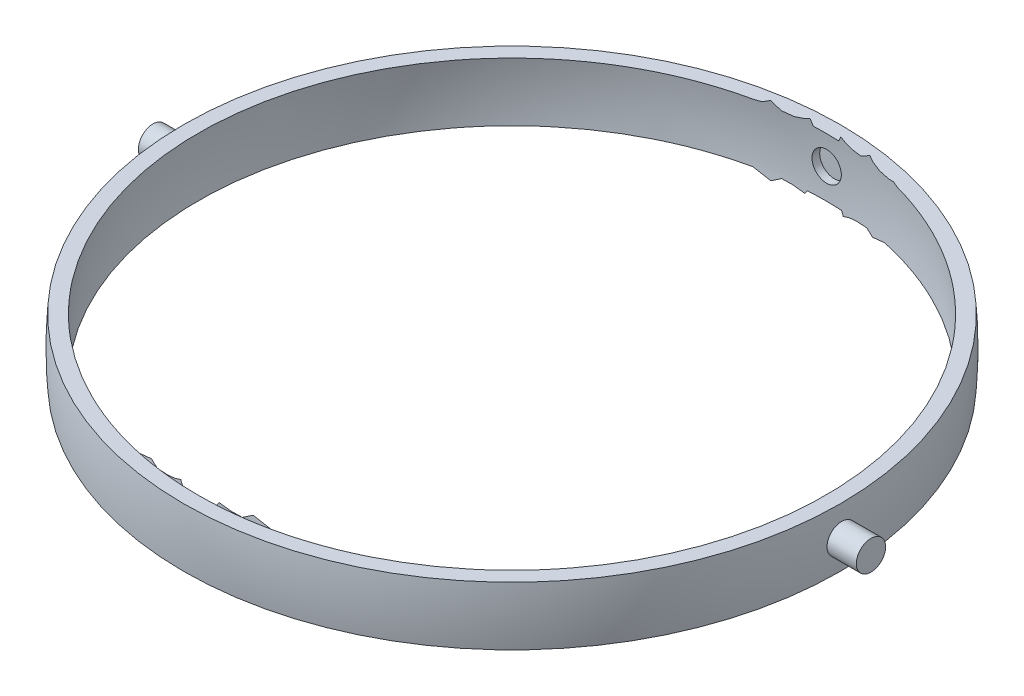
ISO-10303-21;
HEADER;
FILE_DESCRIPTION(('STEP AP214'),'2;1');
FILE_NAME('part.step','',(''),(''),'','','');
FILE_SCHEMA(('AUTOMOTIVE_DESIGN { 1 0 10303 214 1 1 1 1 }'));
ENDSEC;
DATA;
#1=APPLICATION_CONTEXT('core data for automotive mechanical design processes');
#2=APPLICATION_PROTOCOL_DEFINITION('international standard','automotive_design',2000,#1);
#3=PRODUCT_CONTEXT('',#1,'mechanical');
#4=PRODUCT('Part','Part','',(#3));
#5=PRODUCT_RELATED_PRODUCT_CATEGORY('part','',(#4));
#6=PRODUCT_DEFINITION_FORMATION('','',#4);
#7=PRODUCT_DEFINITION_CONTEXT('part definition',#1,'design');
#8=PRODUCT_DEFINITION('design','',#6,#7);
#9=PRODUCT_DEFINITION_SHAPE('','',#8);
#10=(LENGTH_UNIT() NAMED_UNIT(*) SI_UNIT(.MILLI.,.METRE.));
#11=(NAMED_UNIT(*) PLANE_ANGLE_UNIT() SI_UNIT($,.RADIAN.));
#12=(NAMED_UNIT(*) SI_UNIT($,.STERADIAN.) SOLID_ANGLE_UNIT());
#13=UNCERTAINTY_MEASURE_WITH_UNIT(LENGTH_MEASURE(1.E-05),#10,'distance_accuracy_value','');
#14=(GEOMETRIC_REPRESENTATION_CONTEXT(3) GLOBAL_UNCERTAINTY_ASSIGNED_CONTEXT((#13)) GLOBAL_UNIT_ASSIGNED_CONTEXT((#10,
#11,#12)) REPRESENTATION_CONTEXT('',''));
#15=CARTESIAN_POINT('',(0.,0.,0.));
#16=DIRECTION('',(0.,0.,1.));
#17=DIRECTION('',(1.,0.,0.));
#18=AXIS2_PLACEMENT_3D('',#15,#16,#17);
#19=CARTESIAN_POINT('',(0.,0.,0.));
#20=DIRECTION('',(0.,0.,1.));
#21=DIRECTION('',(1.,0.,0.));
#22=AXIS2_PLACEMENT_3D('',#19,#20,#21);
#23=CYLINDRICAL_SURFACE('',#22,2.);
#24=CARTESIAN_POINT('',(0.,0.,-44.));
#25=DIRECTION('',(0.,0.,-1.));
#26=DIRECTION('',(1.,0.,0.));
#27=AXIS2_PLACEMENT_3D('',#24,#25,#26);
#28=CIRCLE('',#27,2.);
#29=CARTESIAN_POINT('',(-2.,0.,-44.));
#30=VERTEX_POINT('',#29);
#31=EDGE_CURVE('P0_E10',#30,#30,#28,.T.);
#32=ORIENTED_EDGE('',*,*,#31,.T.);
#33=DIRECTION('',(0.,0.,1.));
#34=VECTOR('',#33,1.);
#35=CARTESIAN_POINT('',(-2.,0.,0.));
#36=LINE('',#35,#34);
#37=CARTESIAN_POINT('',(-2.,0.,-42.9534631898291));
#38=VERTEX_POINT('',#37);
#39=EDGE_CURVE('P0_E26',#30,#38,#36,.T.);
#40=ORIENTED_EDGE('',*,*,#39,.T.);
#41=CARTESIAN_POINT('',(0.,0.,-42.9534631898291));
#42=DIRECTION('',(0.,0.,-1.));
#43=DIRECTION('',(1.,0.,0.));
#44=AXIS2_PLACEMENT_3D('',#41,#42,#43);
#45=CIRCLE('',#44,2.);
#46=EDGE_CURVE('P0_E130',#38,#38,#45,.T.);
#47=ORIENTED_EDGE('',*,*,#46,.F.);
#48=ORIENTED_EDGE('',*,*,#39,.F.);
#49=EDGE_LOOP('',(#32,#40,#47,#48));
#50=FACE_BOUND('',#49,.T.);
#51=ADVANCED_FACE('P0_F15',(#50),#23,.F.);
#52=CARTESIAN_POINT('',(0.,0.,-44.));
#53=DIRECTION('',(0.,0.,1.));
#54=DIRECTION('',(1.,0.,0.));
#55=AXIS2_PLACEMENT_3D('',#52,#53,#54);
#56=PLANE('',#55);
#57=ORIENTED_EDGE('',*,*,#31,.F.);
#58=EDGE_LOOP('',(#57));
#59=FACE_BOUND('',#58,.T.);
#60=ADVANCED_FACE('P0_F147',(#59),#56,.T.);
#61=CARTESIAN_POINT('',(0.,0.,0.));
#62=DIRECTION('',(0.,0.,1.));
#63=DIRECTION('',(1.,0.,0.));
#64=AXIS2_PLACEMENT_3D('',#61,#62,#63);
#65=CYLINDRICAL_SURFACE('',#64,2.);
#66=CARTESIAN_POINT('',(0.,0.,42.9534631898291));
#67=DIRECTION('',(0.,0.,1.));
#68=DIRECTION('',(1.,0.,0.));
#69=AXIS2_PLACEMENT_3D('',#66,#67,#68);
#70=CIRCLE('',#69,2.);
#71=CARTESIAN_POINT('',(-2.,0.,42.9534631898291));
#72=VERTEX_POINT('',#71);
#73=EDGE_CURVE('P0_E88',#72,#72,#70,.T.);
#74=ORIENTED_EDGE('',*,*,#73,.F.);
#75=DIRECTION('',(0.,0.,1.));
#76=VECTOR('',#75,1.);
#77=CARTESIAN_POINT('',(-2.,0.,0.));
#78=LINE('',#77,#76);
#79=CARTESIAN_POINT('',(-2.,0.,44.));
#80=VERTEX_POINT('',#79);
#81=EDGE_CURVE('P0_E113',#72,#80,#78,.T.);
#82=ORIENTED_EDGE('',*,*,#81,.T.);
#83=CARTESIAN_POINT('',(0.,0.,44.));
#84=DIRECTION('',(0.,0.,1.));
#85=DIRECTION('',(1.,0.,0.));
#86=AXIS2_PLACEMENT_3D('',#83,#84,#85);
#87=CIRCLE('',#86,2.);
#88=EDGE_CURVE('P0_E123',#80,#80,#87,.T.);
#89=ORIENTED_EDGE('',*,*,#88,.T.);
#90=ORIENTED_EDGE('',*,*,#81,.F.);
#91=EDGE_LOOP('',(#74,#82,#89,#90));
#92=FACE_BOUND('',#91,.T.);
#93=ADVANCED_FACE('P0_F144',(#92),#65,.F.);
#94=CARTESIAN_POINT('',(0.,0.,44.));
#95=DIRECTION('',(0.,0.,1.));
#96=DIRECTION('',(1.,0.,0.));
#97=AXIS2_PLACEMENT_3D('',#94,#95,#96);
#98=PLANE('',#97);
#99=ORIENTED_EDGE('',*,*,#88,.F.);
#100=EDGE_LOOP('',(#99));
#101=FACE_BOUND('',#100,.T.);
#102=ADVANCED_FACE('P0_F146',(#101),#98,.F.);
#103=CARTESIAN_POINT('',(0.,0.,0.));
#104=DIRECTION('',(0.,0.,1.));
#105=DIRECTION('',(1.,0.,0.));
#106=AXIS2_PLACEMENT_3D('',#103,#104,#105);
#107=SPHERICAL_SURFACE('',#106,43.);
#108=ORIENTED_EDGE('',*,*,#46,.T.);
#109=CARTESIAN_POINT('',(0.,0.,0.));
#110=DIRECTION('',(0.,1.,0.));
#111=DIRECTION('',(-1.,0.,0.));
#112=AXIS2_PLACEMENT_3D('',#109,#110,#111);
#113=CIRCLE('',#112,43.);
#114=EDGE_CURVE('P0_E19',#38,#72,#113,.T.);
#115=ORIENTED_EDGE('',*,*,#114,.T.);
#116=ORIENTED_EDGE('',*,*,#73,.T.);
#117=ORIENTED_EDGE('',*,*,#114,.F.);
#118=EDGE_LOOP('',(#108,#115,#116,#117));
#119=FACE_BOUND('',#118,.T.);
#120=CARTESIAN_POINT('',(0.,-4.,0.));
#121=DIRECTION('',(0.,1.,0.));
#122=DIRECTION('',(0.,0.,-1.));
#123=AXIS2_PLACEMENT_3D('',#120,#121,#122);
#124=CIRCLE('',#123,42.8135492572153);
#125=CARTESIAN_POINT('',(0.,-4.,42.8135492572153));
#126=VERTEX_POINT('',#125);
#127=EDGE_CURVE('P0_E83',#126,#126,#124,.T.);
#128=ORIENTED_EDGE('',*,*,#127,.F.);
#129=EDGE_LOOP('',(#128));
#130=FACE_BOUND('',#129,.T.);
#131=CARTESIAN_POINT('',(0.,4.,0.));
#132=DIRECTION('',(0.,-1.,0.));
#133=DIRECTION('',(0.,0.,1.));
#134=AXIS2_PLACEMENT_3D('',#131,#132,#133);
#135=CIRCLE('',#134,42.8135492572153);
#136=CARTESIAN_POINT('',(0.,4.,-42.8135492572153));
#137=VERTEX_POINT('',#136);
#138=EDGE_CURVE('P0_E89',#137,#137,#135,.T.);
#139=ORIENTED_EDGE('',*,*,#138,.F.);
#140=EDGE_LOOP('',(#139));
#141=FACE_BOUND('',#140,.T.);
#142=ADVANCED_FACE('P0_F84',(#119,#130,#141),#107,.F.);
#143=CARTESIAN_POINT('',(65.,-4.,0.));
#144=DIRECTION('',(0.,1.,0.));
#145=DIRECTION('',(1.,0.,0.));
#146=AXIS2_PLACEMENT_3D('',#143,#144,#145);
#147=PLANE('',#146);
#148=CARTESIAN_POINT('',(0.,-4.,0.));
#149=DIRECTION('',(0.,1.,0.));
#150=DIRECTION('',(0.,0.,-1.));
#151=AXIS2_PLACEMENT_3D('',#148,#149,#150);
#152=CIRCLE('',#151,44.8218696620299);
#153=CARTESIAN_POINT('',(0.,-4.,44.8218696620299));
#154=VERTEX_POINT('',#153);
#155=EDGE_CURVE('P0_E55',#154,#154,#152,.T.);
#156=ORIENTED_EDGE('',*,*,#155,.F.);
#157=EDGE_LOOP('',(#156));
#158=FACE_BOUND('',#157,.T.);
#159=ORIENTED_EDGE('',*,*,#127,.T.);
#160=EDGE_LOOP('',(#159));
#161=FACE_BOUND('',#160,.T.);
#162=ADVANCED_FACE('P0_F165',(#158,#161),#147,.F.);
#163=CARTESIAN_POINT('',(-65.,4.,0.));
#164=DIRECTION('',(0.,-1.,0.));
#165=DIRECTION('',(0.,0.,-1.));
#166=AXIS2_PLACEMENT_3D('',#163,#164,#165);
#167=PLANE('',#166);
#168=CARTESIAN_POINT('',(0.,4.,0.));
#169=DIRECTION('',(0.,-1.,0.));
#170=DIRECTION('',(0.,0.,1.));
#171=AXIS2_PLACEMENT_3D('',#168,#169,#170);
#172=CIRCLE('',#171,44.8218696620299);
#173=CARTESIAN_POINT('',(0.,4.,-44.8218696620299));
#174=VERTEX_POINT('',#173);
#175=EDGE_CURVE('P0_E63',#174,#174,#172,.T.);
#176=ORIENTED_EDGE('',*,*,#175,.F.);
#177=EDGE_LOOP('',(#176));
#178=FACE_BOUND('',#177,.T.);
#179=ORIENTED_EDGE('',*,*,#138,.T.);
#180=EDGE_LOOP('',(#179));
#181=FACE_BOUND('',#180,.T.);
#182=ADVANCED_FACE('P0_F17',(#178,#181),#167,.F.);
#183=CARTESIAN_POINT('',(0.,0.,0.));
#184=DIRECTION('',(0.,0.,1.));
#185=DIRECTION('',(1.,0.,0.));
#186=AXIS2_PLACEMENT_3D('',#183,#184,#185);
#187=SPHERICAL_SURFACE('',#186,45.);
#188=CARTESIAN_POINT('',(0.,0.,0.));
#189=DIRECTION('',(0.,-1.,0.));
#190=DIRECTION('',(-1.,0.,0.));
#191=AXIS2_PLACEMENT_3D('',#188,#189,#190);
#192=SPHERICAL_SURFACE('',#191,45.);
#193=CARTESIAN_POINT('',(0.,0.,0.));
#194=DIRECTION('',(0.,-1.,0.));
#195=DIRECTION('',(-1.,0.,0.));
#196=AXIS2_PLACEMENT_3D('',#193,#194,#195);
#197=CIRCLE('',#196,45.);
#198=CARTESIAN_POINT('',(0.,0.,45.));
#199=VERTEX_POINT('',#198);
#200=CARTESIAN_POINT('',(0.,0.,-45.));
#201=VERTEX_POINT('',#200);
#202=EDGE_CURVE('P0_E69',#199,#201,#197,.T.);
#203=ORIENTED_EDGE('',*,*,#202,.T.);
#204=ORIENTED_EDGE('',*,*,#202,.F.);
#205=EDGE_LOOP('',(#203,#204));
#206=FACE_BOUND('',#205,.T.);
#207=ORIENTED_EDGE('',*,*,#155,.T.);
#208=EDGE_LOOP('',(#207));
#209=FACE_BOUND('',#208,.T.);
#210=ORIENTED_EDGE('',*,*,#175,.T.);
#211=EDGE_LOOP('',(#210));
#212=FACE_BOUND('',#211,.T.);
#213=ADVANCED_FACE('P0_F166',(#206,#209,#212),#192,.T.);
#214=CLOSED_SHELL('',(#51,#60,#93,#102,#142,#162,#182,#213));
#215=MANIFOLD_SOLID_BREP('P0_B1',#214);
#216=CARTESIAN_POINT('',(-49.0000006705522,0.,0.));
#217=DIRECTION('',(1.,0.,0.));
#218=DIRECTION('',(0.,1.,0.));
#219=AXIS2_PLACEMENT_3D('',#216,#217,#218);
#220=PLANE('',#219);
#221=CARTESIAN_POINT('',(-49.0000006705522,0.,0.));
#222=DIRECTION('',(-1.,0.,0.));
#223=DIRECTION('',(0.,1.,0.));
#224=AXIS2_PLACEMENT_3D('',#221,#222,#223);
#225=CIRCLE('',#224,2.);
#226=CARTESIAN_POINT('',(-49.0000006705522,-2.,0.));
#227=VERTEX_POINT('',#226);
#228=EDGE_CURVE('P1_E11',#227,#227,#225,.T.);
#229=ORIENTED_EDGE('',*,*,#228,.T.);
#230=EDGE_LOOP('',(#229));
#231=FACE_BOUND('',#230,.T.);
#232=ADVANCED_FACE('P1_F16',(#231),#220,.F.);
#233=CARTESIAN_POINT('',(-45.0000006705523,0.,0.));
#234=DIRECTION('',(1.,0.,0.));
#235=DIRECTION('',(0.,1.,0.));
#236=AXIS2_PLACEMENT_3D('',#233,#234,#235);
#237=CYLINDRICAL_SURFACE('',#236,2.);
#238=ORIENTED_EDGE('',*,*,#228,.F.);
#239=DIRECTION('',(1.,0.,0.));
#240=VECTOR('',#239,1.);
#241=CARTESIAN_POINT('',(-45.0000006705523,-2.,0.));
#242=LINE('',#241,#240);
#243=CARTESIAN_POINT('',(-45.0000006705523,-2.,0.));
#244=VERTEX_POINT('',#243);
#245=EDGE_CURVE('P1_E20',#227,#244,#242,.T.);
#246=ORIENTED_EDGE('',*,*,#245,.T.);
#247=CARTESIAN_POINT('',(-45.0000006705523,0.,0.));
#248=DIRECTION('',(1.,0.,0.));
#249=DIRECTION('',(0.,1.,0.));
#250=AXIS2_PLACEMENT_3D('',#247,#248,#249);
#251=CIRCLE('',#250,2.);
#252=EDGE_CURVE('P1_E40',#244,#244,#251,.T.);
#253=ORIENTED_EDGE('',*,*,#252,.F.);
#254=ORIENTED_EDGE('',*,*,#245,.F.);
#255=EDGE_LOOP('',(#238,#246,#253,#254));
#256=FACE_BOUND('',#255,.T.);
#257=ADVANCED_FACE('P1_F18',(#256),#237,.T.);
#258=CARTESIAN_POINT('',(-45.0000006705523,0.,0.));
#259=DIRECTION('',(1.,0.,0.));
#260=DIRECTION('',(0.,1.,0.));
#261=AXIS2_PLACEMENT_3D('',#258,#259,#260);
#262=PLANE('',#261);
#263=ORIENTED_EDGE('',*,*,#252,.T.);
#264=EDGE_LOOP('',(#263));
#265=FACE_BOUND('',#264,.T.);
#266=ADVANCED_FACE('P1_F57',(#265),#262,.T.);
#267=CLOSED_SHELL('',(#232,#257,#266));
#268=MANIFOLD_SOLID_BREP('P1_B1',#267);
#269=CARTESIAN_POINT('',(49.0000006705522,0.,0.));
#270=DIRECTION('',(1.,0.,0.));
#271=DIRECTION('',(0.,1.,0.));
#272=AXIS2_PLACEMENT_3D('',#269,#270,#271);
#273=PLANE('',#272);
#274=CARTESIAN_POINT('',(49.0000006705522,0.,0.));
#275=DIRECTION('',(1.,0.,0.));
#276=DIRECTION('',(0.,1.,0.));
#277=AXIS2_PLACEMENT_3D('',#274,#275,#276);
#278=CIRCLE('',#277,2.);
#279=CARTESIAN_POINT('',(49.0000006705522,-2.,0.));
#280=VERTEX_POINT('',#279);
#281=EDGE_CURVE('P2_E10',#280,#280,#278,.T.);
#282=ORIENTED_EDGE('',*,*,#281,.T.);
#283=EDGE_LOOP('',(#282));
#284=FACE_BOUND('',#283,.T.);
#285=ADVANCED_FACE('P2_F15',(#284),#273,.T.);
#286=CARTESIAN_POINT('',(45.0000006705523,0.,0.));
#287=DIRECTION('',(1.,0.,0.));
#288=DIRECTION('',(0.,1.,0.));
#289=AXIS2_PLACEMENT_3D('',#286,#287,#288);
#290=CYLINDRICAL_SURFACE('',#289,2.);
#291=ORIENTED_EDGE('',*,*,#281,.F.);
#292=DIRECTION('',(-1.,0.,0.));
#293=VECTOR('',#292,1.);
#294=CARTESIAN_POINT('',(45.0000006705523,-2.,0.));
#295=LINE('',#294,#293);
#296=CARTESIAN_POINT('',(45.0000006705523,-2.,0.));
#297=VERTEX_POINT('',#296);
#298=EDGE_CURVE('P2_E19',#280,#297,#295,.T.);
#299=ORIENTED_EDGE('',*,*,#298,.T.);
#300=CARTESIAN_POINT('',(45.0000006705523,0.,0.));
#301=DIRECTION('',(1.,0.,0.));
#302=DIRECTION('',(0.,1.,0.));
#303=AXIS2_PLACEMENT_3D('',#300,#301,#302);
#304=CIRCLE('',#303,2.);
#305=EDGE_CURVE('P2_E41',#297,#297,#304,.T.);
#306=ORIENTED_EDGE('',*,*,#305,.T.);
#307=ORIENTED_EDGE('',*,*,#298,.F.);
#308=EDGE_LOOP('',(#291,#299,#306,#307));
#309=FACE_BOUND('',#308,.T.);
#310=ADVANCED_FACE('P2_F17',(#309),#290,.T.);
#311=CARTESIAN_POINT('',(45.0000006705523,0.,0.));
#312=DIRECTION('',(1.,0.,0.));
#313=DIRECTION('',(0.,1.,0.));
#314=AXIS2_PLACEMENT_3D('',#311,#312,#313);
#315=PLANE('',#314);
#316=ORIENTED_EDGE('',*,*,#305,.F.);
#317=EDGE_LOOP('',(#316));
#318=FACE_BOUND('',#317,.T.);
#319=ADVANCED_FACE('P2_F42',(#318),#315,.F.);
#320=CLOSED_SHELL('',(#285,#310,#319));
#321=MANIFOLD_SOLID_BREP('P2_B1',#320);
#322=ADVANCED_BREP_SHAPE_REPRESENTATION('',(#18,#215,#268,#321),#14);
#323=SHAPE_DEFINITION_REPRESENTATION(#9,#322);
ENDSEC;
END-ISO-10303-21;
